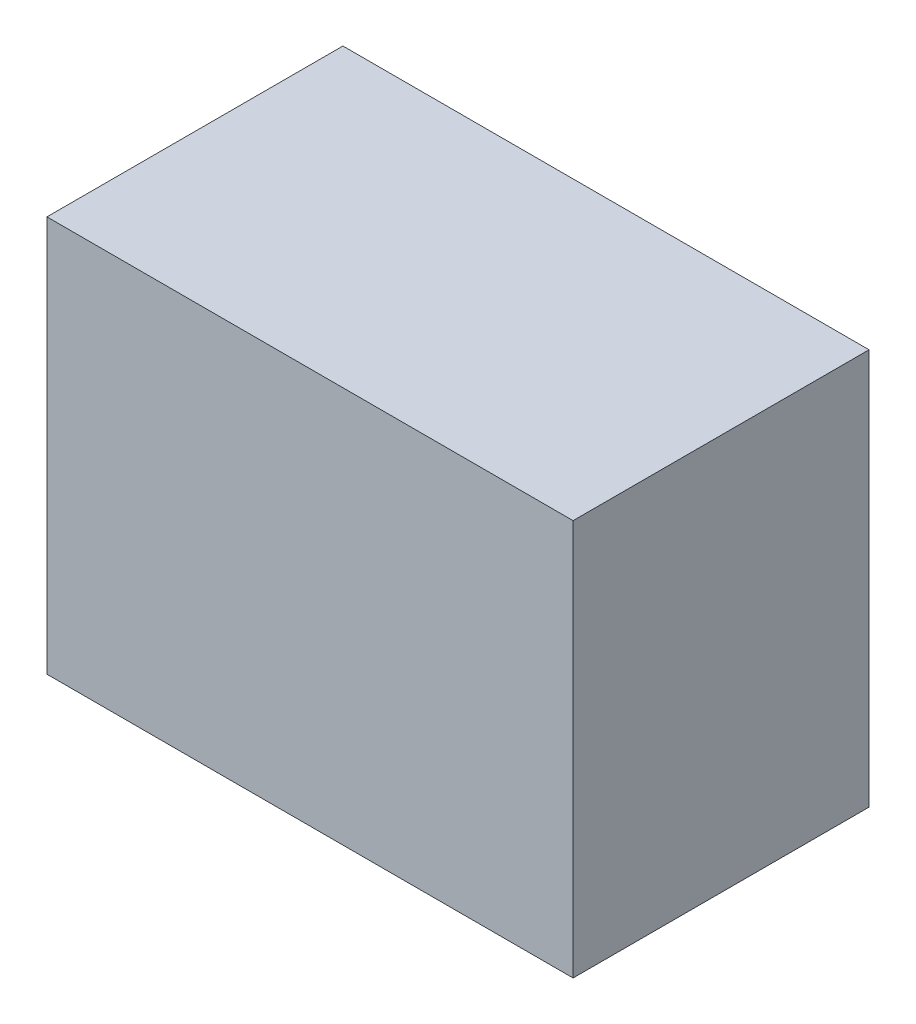
ISO-10303-21;
HEADER;
FILE_DESCRIPTION(('STEP AP214'),'2;1');
FILE_NAME('part.step','',(''),(''),'','','');
FILE_SCHEMA(('AUTOMOTIVE_DESIGN { 1 0 10303 214 1 1 1 1 }'));
ENDSEC;
DATA;
#1=APPLICATION_CONTEXT('core data for automotive mechanical design processes');
#2=APPLICATION_PROTOCOL_DEFINITION('international standard','automotive_design',2000,#1);
#3=PRODUCT_CONTEXT('',#1,'mechanical');
#4=PRODUCT('Part','Part','',(#3));
#5=PRODUCT_RELATED_PRODUCT_CATEGORY('part','',(#4));
#6=PRODUCT_DEFINITION_FORMATION('','',#4);
#7=PRODUCT_DEFINITION_CONTEXT('part definition',#1,'design');
#8=PRODUCT_DEFINITION('design','',#6,#7);
#9=PRODUCT_DEFINITION_SHAPE('','',#8);
#10=(LENGTH_UNIT() NAMED_UNIT(*) SI_UNIT(.MILLI.,.METRE.));
#11=(NAMED_UNIT(*) PLANE_ANGLE_UNIT() SI_UNIT($,.RADIAN.));
#12=(NAMED_UNIT(*) SI_UNIT($,.STERADIAN.) SOLID_ANGLE_UNIT());
#13=UNCERTAINTY_MEASURE_WITH_UNIT(LENGTH_MEASURE(1.E-05),#10,'distance_accuracy_value','');
#14=(GEOMETRIC_REPRESENTATION_CONTEXT(3) GLOBAL_UNCERTAINTY_ASSIGNED_CONTEXT((#13)) GLOBAL_UNIT_ASSIGNED_CONTEXT((#10,
#11,#12)) REPRESENTATION_CONTEXT('',''));
#15=CARTESIAN_POINT('',(0.,0.,0.));
#16=DIRECTION('',(0.,0.,1.));
#17=DIRECTION('',(1.,0.,0.));
#18=AXIS2_PLACEMENT_3D('',#15,#16,#17);
#19=CARTESIAN_POINT('',(0.,293710.106,0.));
#20=DIRECTION('',(-1.,0.,0.));
#21=DIRECTION('',(0.,0.,1.));
#22=AXIS2_PLACEMENT_3D('',#19,#20,#21);
#23=PLANE('',#22);
#24=DIRECTION('',(0.,0.,-1.));
#25=VECTOR('',#24,1.);
#26=CARTESIAN_POINT('',(0.,0.,0.));
#27=LINE('',#26,#25);
#28=CARTESIAN_POINT('',(0.,0.,0.));
#29=VERTEX_POINT('',#28);
#30=CARTESIAN_POINT('',(0.,0.,-219456.));
#31=VERTEX_POINT('',#30);
#32=EDGE_CURVE('E99',#29,#31,#27,.T.);
#33=ORIENTED_EDGE('',*,*,#32,.F.);
#34=DIRECTION('',(0.,-1.,0.));
#35=VECTOR('',#34,1.);
#36=CARTESIAN_POINT('',(0.,293710.106,0.));
#37=LINE('',#36,#35);
#38=CARTESIAN_POINT('',(0.,293710.106,0.));
#39=VERTEX_POINT('',#38);
#40=EDGE_CURVE('E11',#39,#29,#37,.T.);
#41=ORIENTED_EDGE('',*,*,#40,.F.);
#42=DIRECTION('',(0.,0.,-1.));
#43=VECTOR('',#42,1.);
#44=CARTESIAN_POINT('',(0.,293710.106,0.));
#45=LINE('',#44,#43);
#46=CARTESIAN_POINT('',(0.,293710.106,-219456.));
#47=VERTEX_POINT('',#46);
#48=EDGE_CURVE('E94',#39,#47,#45,.T.);
#49=ORIENTED_EDGE('',*,*,#48,.T.);
#50=DIRECTION('',(0.,-1.,0.));
#51=VECTOR('',#50,1.);
#52=CARTESIAN_POINT('',(0.,293710.106,-219456.));
#53=LINE('',#52,#51);
#54=EDGE_CURVE('E37',#47,#31,#53,.T.);
#55=ORIENTED_EDGE('',*,*,#54,.T.);
#56=EDGE_LOOP('',(#33,#41,#49,#55));
#57=FACE_BOUND('',#56,.T.);
#58=ADVANCED_FACE('F34',(#57),#23,.T.);
#59=CARTESIAN_POINT('',(0.,293710.106,0.));
#60=DIRECTION('',(0.,0.,-1.));
#61=DIRECTION('',(-1.,0.,0.));
#62=AXIS2_PLACEMENT_3D('',#59,#60,#61);
#63=PLANE('',#62);
#64=DIRECTION('',(1.,0.,0.));
#65=VECTOR('',#64,1.);
#66=CARTESIAN_POINT('',(0.,0.,0.));
#67=LINE('',#66,#65);
#68=CARTESIAN_POINT('',(390144.,0.,0.));
#69=VERTEX_POINT('',#68);
#70=EDGE_CURVE('E67',#29,#69,#67,.T.);
#71=ORIENTED_EDGE('',*,*,#70,.T.);
#72=DIRECTION('',(0.,-1.,0.));
#73=VECTOR('',#72,1.);
#74=CARTESIAN_POINT('',(390144.,293710.106,0.));
#75=LINE('',#74,#73);
#76=CARTESIAN_POINT('',(390144.,293710.106,0.));
#77=VERTEX_POINT('',#76);
#78=EDGE_CURVE('E43',#77,#69,#75,.T.);
#79=ORIENTED_EDGE('',*,*,#78,.F.);
#80=DIRECTION('',(1.,0.,0.));
#81=VECTOR('',#80,1.);
#82=CARTESIAN_POINT('',(0.,293710.106,0.));
#83=LINE('',#82,#81);
#84=EDGE_CURVE('E84',#39,#77,#83,.T.);
#85=ORIENTED_EDGE('',*,*,#84,.F.);
#86=ORIENTED_EDGE('',*,*,#40,.T.);
#87=EDGE_LOOP('',(#71,#79,#85,#86));
#88=FACE_BOUND('',#87,.T.);
#89=ADVANCED_FACE('F109',(#88),#63,.F.);
#90=CARTESIAN_POINT('',(390144.,293710.106,0.));
#91=DIRECTION('',(-1.,0.,0.));
#92=DIRECTION('',(0.,0.,1.));
#93=AXIS2_PLACEMENT_3D('',#90,#91,#92);
#94=PLANE('',#93);
#95=DIRECTION('',(0.,0.,-1.));
#96=VECTOR('',#95,1.);
#97=CARTESIAN_POINT('',(390144.,0.,0.));
#98=LINE('',#97,#96);
#99=CARTESIAN_POINT('',(390144.,0.,-219456.));
#100=VERTEX_POINT('',#99);
#101=EDGE_CURVE('E91',#69,#100,#98,.T.);
#102=ORIENTED_EDGE('',*,*,#101,.T.);
#103=DIRECTION('',(0.,-1.,0.));
#104=VECTOR('',#103,1.);
#105=CARTESIAN_POINT('',(390144.,293710.106,-219456.));
#106=LINE('',#105,#104);
#107=CARTESIAN_POINT('',(390144.,293710.106,-219456.));
#108=VERTEX_POINT('',#107);
#109=EDGE_CURVE('E88',#108,#100,#106,.T.);
#110=ORIENTED_EDGE('',*,*,#109,.F.);
#111=DIRECTION('',(0.,0.,-1.));
#112=VECTOR('',#111,1.);
#113=CARTESIAN_POINT('',(390144.,293710.106,0.));
#114=LINE('',#113,#112);
#115=EDGE_CURVE('E79',#77,#108,#114,.T.);
#116=ORIENTED_EDGE('',*,*,#115,.F.);
#117=ORIENTED_EDGE('',*,*,#78,.T.);
#118=EDGE_LOOP('',(#102,#110,#116,#117));
#119=FACE_BOUND('',#118,.T.);
#120=ADVANCED_FACE('F89',(#119),#94,.F.);
#121=CARTESIAN_POINT('',(0.,293710.106,-219456.));
#122=DIRECTION('',(0.,0.,-1.));
#123=DIRECTION('',(-1.,0.,0.));
#124=AXIS2_PLACEMENT_3D('',#121,#122,#123);
#125=PLANE('',#124);
#126=DIRECTION('',(1.,0.,0.));
#127=VECTOR('',#126,1.);
#128=CARTESIAN_POINT('',(0.,0.,-219456.));
#129=LINE('',#128,#127);
#130=EDGE_CURVE('E102',#31,#100,#129,.T.);
#131=ORIENTED_EDGE('',*,*,#130,.F.);
#132=ORIENTED_EDGE('',*,*,#54,.F.);
#133=DIRECTION('',(1.,0.,0.));
#134=VECTOR('',#133,1.);
#135=CARTESIAN_POINT('',(0.,293710.106,-219456.));
#136=LINE('',#135,#134);
#137=EDGE_CURVE('E83',#47,#108,#136,.T.);
#138=ORIENTED_EDGE('',*,*,#137,.T.);
#139=ORIENTED_EDGE('',*,*,#109,.T.);
#140=EDGE_LOOP('',(#131,#132,#138,#139));
#141=FACE_BOUND('',#140,.T.);
#142=ADVANCED_FACE('F93',(#141),#125,.T.);
#143=CARTESIAN_POINT('',(0.,293710.106,0.));
#144=DIRECTION('',(0.,-1.,0.));
#145=DIRECTION('',(0.,0.,-1.));
#146=AXIS2_PLACEMENT_3D('',#143,#144,#145);
#147=PLANE('',#146);
#148=ORIENTED_EDGE('',*,*,#48,.F.);
#149=ORIENTED_EDGE('',*,*,#84,.T.);
#150=ORIENTED_EDGE('',*,*,#115,.T.);
#151=ORIENTED_EDGE('',*,*,#137,.F.);
#152=EDGE_LOOP('',(#148,#149,#150,#151));
#153=FACE_BOUND('',#152,.T.);
#154=ADVANCED_FACE('F82',(#153),#147,.F.);
#155=CARTESIAN_POINT('',(0.,0.,0.));
#156=DIRECTION('',(0.,-1.,0.));
#157=DIRECTION('',(0.,0.,-1.));
#158=AXIS2_PLACEMENT_3D('',#155,#156,#157);
#159=PLANE('',#158);
#160=ORIENTED_EDGE('',*,*,#32,.T.);
#161=ORIENTED_EDGE('',*,*,#130,.T.);
#162=ORIENTED_EDGE('',*,*,#101,.F.);
#163=ORIENTED_EDGE('',*,*,#70,.F.);
#164=EDGE_LOOP('',(#160,#161,#162,#163));
#165=FACE_BOUND('',#164,.T.);
#166=ADVANCED_FACE('F107',(#165),#159,.T.);
#167=CLOSED_SHELL('',(#58,#89,#120,#142,#154,#166));
#168=MANIFOLD_SOLID_BREP('B2',#167);
#169=ADVANCED_BREP_SHAPE_REPRESENTATION('',(#18,#168),#14);
#170=SHAPE_DEFINITION_REPRESENTATION(#9,#169);
ENDSEC;
END-ISO-10303-21;
